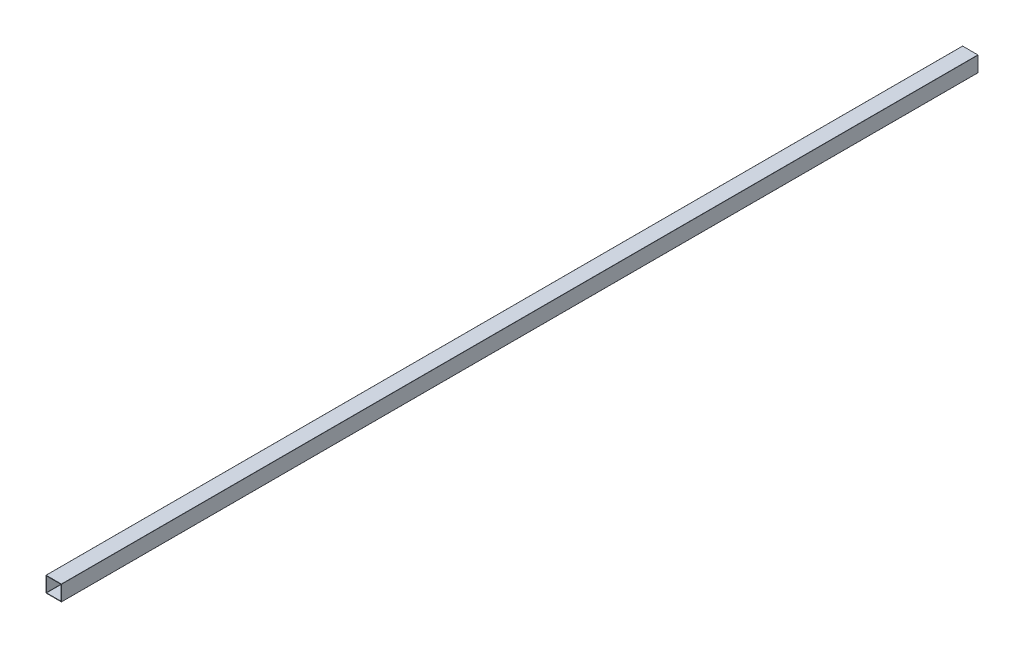
ISO-10303-21;
HEADER;
FILE_DESCRIPTION(('STEP AP214'),'2;1');
FILE_NAME('part.step','',(''),(''),'','','');
FILE_SCHEMA(('AUTOMOTIVE_DESIGN { 1 0 10303 214 1 1 1 1 }'));
ENDSEC;
DATA;
#1=APPLICATION_CONTEXT('core data for automotive mechanical design processes');
#2=APPLICATION_PROTOCOL_DEFINITION('international standard','automotive_design',2000,#1);
#3=PRODUCT_CONTEXT('',#1,'mechanical');
#4=PRODUCT('Part','Part','',(#3));
#5=PRODUCT_RELATED_PRODUCT_CATEGORY('part','',(#4));
#6=PRODUCT_DEFINITION_FORMATION('','',#4);
#7=PRODUCT_DEFINITION_CONTEXT('part definition',#1,'design');
#8=PRODUCT_DEFINITION('design','',#6,#7);
#9=PRODUCT_DEFINITION_SHAPE('','',#8);
#10=(LENGTH_UNIT() NAMED_UNIT(*) SI_UNIT(.MILLI.,.METRE.));
#11=(NAMED_UNIT(*) PLANE_ANGLE_UNIT() SI_UNIT($,.RADIAN.));
#12=(NAMED_UNIT(*) SI_UNIT($,.STERADIAN.) SOLID_ANGLE_UNIT());
#13=UNCERTAINTY_MEASURE_WITH_UNIT(LENGTH_MEASURE(1.E-05),#10,'distance_accuracy_value','');
#14=(GEOMETRIC_REPRESENTATION_CONTEXT(3) GLOBAL_UNCERTAINTY_ASSIGNED_CONTEXT((#13)) GLOBAL_UNIT_ASSIGNED_CONTEXT((#10,
#11,#12)) REPRESENTATION_CONTEXT('',''));
#15=CARTESIAN_POINT('',(0.,0.,0.));
#16=DIRECTION('',(0.,0.,1.));
#17=DIRECTION('',(1.,0.,0.));
#18=AXIS2_PLACEMENT_3D('',#15,#16,#17);
#19=CARTESIAN_POINT('',(50.8,-50.8,-6000.));
#20=DIRECTION('',(1.,0.,0.));
#21=DIRECTION('',(0.,0.,-1.));
#22=AXIS2_PLACEMENT_3D('',#19,#20,#21);
#23=PLANE('',#22);
#24=DIRECTION('',(0.,1.,0.));
#25=VECTOR('',#24,1.);
#26=CARTESIAN_POINT('',(50.8,-50.8,0.));
#27=LINE('',#26,#25);
#28=CARTESIAN_POINT('',(50.8,-49.8,0.));
#29=VERTEX_POINT('',#28);
#30=CARTESIAN_POINT('',(50.8,49.8,0.));
#31=VERTEX_POINT('',#30);
#32=EDGE_CURVE('E197',#29,#31,#27,.T.);
#33=ORIENTED_EDGE('',*,*,#32,.F.);
#34=DIRECTION('',(0.,0.,1.));
#35=VECTOR('',#34,1.);
#36=CARTESIAN_POINT('',(50.8,-49.8,-6000.));
#37=LINE('',#36,#35);
#38=CARTESIAN_POINT('',(50.8,-49.8,-6000.));
#39=VERTEX_POINT('',#38);
#40=EDGE_CURVE('E158',#29,#39,#37,.F.);
#41=ORIENTED_EDGE('',*,*,#40,.T.);
#42=DIRECTION('',(0.,1.,0.));
#43=VECTOR('',#42,1.);
#44=CARTESIAN_POINT('',(50.8,-50.8,-6000.));
#45=LINE('',#44,#43);
#46=CARTESIAN_POINT('',(50.8,49.8,-6000.));
#47=VERTEX_POINT('',#46);
#48=EDGE_CURVE('E185',#39,#47,#45,.T.);
#49=ORIENTED_EDGE('',*,*,#48,.T.);
#50=DIRECTION('',(0.,0.,1.));
#51=VECTOR('',#50,1.);
#52=CARTESIAN_POINT('',(50.8,49.8,-6000.));
#53=LINE('',#52,#51);
#54=EDGE_CURVE('E251',#47,#31,#53,.T.);
#55=ORIENTED_EDGE('',*,*,#54,.T.);
#56=EDGE_LOOP('',(#33,#41,#49,#55));
#57=FACE_BOUND('',#56,.T.);
#58=ADVANCED_FACE('F33',(#57),#23,.T.);
#59=CARTESIAN_POINT('',(-50.8,-50.8,-6000.));
#60=DIRECTION('',(0.,-1.,0.));
#61=DIRECTION('',(0.,0.,-1.));
#62=AXIS2_PLACEMENT_3D('',#59,#60,#61);
#63=PLANE('',#62);
#64=DIRECTION('',(1.,0.,0.));
#65=VECTOR('',#64,1.);
#66=CARTESIAN_POINT('',(-50.8,-50.8,0.));
#67=LINE('',#66,#65);
#68=CARTESIAN_POINT('',(-49.8,-50.8,0.));
#69=VERTEX_POINT('',#68);
#70=CARTESIAN_POINT('',(49.8,-50.8,0.));
#71=VERTEX_POINT('',#70);
#72=EDGE_CURVE('E189',#69,#71,#67,.T.);
#73=ORIENTED_EDGE('',*,*,#72,.F.);
#74=DIRECTION('',(0.,0.,1.));
#75=VECTOR('',#74,1.);
#76=CARTESIAN_POINT('',(-49.8,-50.8,-6000.));
#77=LINE('',#76,#75);
#78=CARTESIAN_POINT('',(-49.8,-50.8,-6000.));
#79=VERTEX_POINT('',#78);
#80=EDGE_CURVE('E238',#69,#79,#77,.F.);
#81=ORIENTED_EDGE('',*,*,#80,.T.);
#82=DIRECTION('',(1.,0.,0.));
#83=VECTOR('',#82,1.);
#84=CARTESIAN_POINT('',(-50.8,-50.8,-6000.));
#85=LINE('',#84,#83);
#86=CARTESIAN_POINT('',(49.8,-50.8,-6000.));
#87=VERTEX_POINT('',#86);
#88=EDGE_CURVE('E194',#79,#87,#85,.T.);
#89=ORIENTED_EDGE('',*,*,#88,.T.);
#90=DIRECTION('',(0.,0.,1.));
#91=VECTOR('',#90,1.);
#92=CARTESIAN_POINT('',(49.8,-50.8,-6000.));
#93=LINE('',#92,#91);
#94=EDGE_CURVE('E235',#87,#71,#93,.T.);
#95=ORIENTED_EDGE('',*,*,#94,.T.);
#96=EDGE_LOOP('',(#73,#81,#89,#95));
#97=FACE_BOUND('',#96,.T.);
#98=ADVANCED_FACE('F305',(#97),#63,.T.);
#99=CARTESIAN_POINT('',(-50.8,-50.8,-6000.));
#100=DIRECTION('',(-1.,0.,0.));
#101=DIRECTION('',(0.,0.,1.));
#102=AXIS2_PLACEMENT_3D('',#99,#100,#101);
#103=PLANE('',#102);
#104=DIRECTION('',(0.,-1.,0.));
#105=VECTOR('',#104,1.);
#106=CARTESIAN_POINT('',(-50.8,-50.8,-6000.));
#107=LINE('',#106,#105);
#108=CARTESIAN_POINT('',(-50.8,49.8,-6000.));
#109=VERTEX_POINT('',#108);
#110=CARTESIAN_POINT('',(-50.8,-49.8,-6000.));
#111=VERTEX_POINT('',#110);
#112=EDGE_CURVE('E191',#109,#111,#107,.T.);
#113=ORIENTED_EDGE('',*,*,#112,.T.);
#114=DIRECTION('',(0.,0.,1.));
#115=VECTOR('',#114,1.);
#116=CARTESIAN_POINT('',(-50.8,-49.8,-6000.));
#117=LINE('',#116,#115);
#118=CARTESIAN_POINT('',(-50.8,-49.8,0.));
#119=VERTEX_POINT('',#118);
#120=EDGE_CURVE('E224',#111,#119,#117,.T.);
#121=ORIENTED_EDGE('',*,*,#120,.T.);
#122=DIRECTION('',(0.,-1.,0.));
#123=VECTOR('',#122,1.);
#124=CARTESIAN_POINT('',(-50.8,-50.8,0.));
#125=LINE('',#124,#123);
#126=CARTESIAN_POINT('',(-50.8,49.8,0.));
#127=VERTEX_POINT('',#126);
#128=EDGE_CURVE('E203',#127,#119,#125,.T.);
#129=ORIENTED_EDGE('',*,*,#128,.F.);
#130=DIRECTION('',(0.,0.,1.));
#131=VECTOR('',#130,1.);
#132=CARTESIAN_POINT('',(-50.8,49.8,-6000.));
#133=LINE('',#132,#131);
#134=EDGE_CURVE('E222',#127,#109,#133,.F.);
#135=ORIENTED_EDGE('',*,*,#134,.T.);
#136=EDGE_LOOP('',(#113,#121,#129,#135));
#137=FACE_BOUND('',#136,.T.);
#138=ADVANCED_FACE('F311',(#137),#103,.T.);
#139=CARTESIAN_POINT('',(-50.8,50.8,-6000.));
#140=DIRECTION('',(0.,1.,0.));
#141=DIRECTION('',(0.,0.,1.));
#142=AXIS2_PLACEMENT_3D('',#139,#140,#141);
#143=PLANE('',#142);
#144=DIRECTION('',(-1.,0.,0.));
#145=VECTOR('',#144,1.);
#146=CARTESIAN_POINT('',(-50.8,50.8,-6000.));
#147=LINE('',#146,#145);
#148=CARTESIAN_POINT('',(49.8,50.8,-6000.));
#149=VERTEX_POINT('',#148);
#150=CARTESIAN_POINT('',(-49.8,50.8,-6000.));
#151=VERTEX_POINT('',#150);
#152=EDGE_CURVE('E188',#149,#151,#147,.T.);
#153=ORIENTED_EDGE('',*,*,#152,.T.);
#154=DIRECTION('',(0.,0.,1.));
#155=VECTOR('',#154,1.);
#156=CARTESIAN_POINT('',(-49.8,50.8,-6000.));
#157=LINE('',#156,#155);
#158=CARTESIAN_POINT('',(-49.8,50.8,0.));
#159=VERTEX_POINT('',#158);
#160=EDGE_CURVE('E248',#151,#159,#157,.T.);
#161=ORIENTED_EDGE('',*,*,#160,.T.);
#162=DIRECTION('',(-1.,0.,0.));
#163=VECTOR('',#162,1.);
#164=CARTESIAN_POINT('',(-50.8,50.8,0.));
#165=LINE('',#164,#163);
#166=CARTESIAN_POINT('',(49.8,50.8,0.));
#167=VERTEX_POINT('',#166);
#168=EDGE_CURVE('E200',#167,#159,#165,.T.);
#169=ORIENTED_EDGE('',*,*,#168,.F.);
#170=DIRECTION('',(0.,0.,1.));
#171=VECTOR('',#170,1.);
#172=CARTESIAN_POINT('',(49.8,50.8,-6000.));
#173=LINE('',#172,#171);
#174=EDGE_CURVE('E55',#167,#149,#173,.F.);
#175=ORIENTED_EDGE('',*,*,#174,.T.);
#176=EDGE_LOOP('',(#153,#161,#169,#175));
#177=FACE_BOUND('',#176,.T.);
#178=ADVANCED_FACE('F316',(#177),#143,.T.);
#179=CARTESIAN_POINT('',(0.,0.,-6000.));
#180=DIRECTION('',(0.,0.,-1.));
#181=DIRECTION('',(-1.,0.,0.));
#182=AXIS2_PLACEMENT_3D('',#179,#180,#181);
#183=PLANE('',#182);
#184=DIRECTION('',(0.,-1.,0.));
#185=VECTOR('',#184,1.);
#186=CARTESIAN_POINT('',(-47.76,-47.76,-6000.));
#187=LINE('',#186,#185);
#188=CARTESIAN_POINT('',(-47.76,46.76,-6000.));
#189=VERTEX_POINT('',#188);
#190=CARTESIAN_POINT('',(-47.76,-46.76,-6000.));
#191=VERTEX_POINT('',#190);
#192=EDGE_CURVE('E167',#189,#191,#187,.T.);
#193=ORIENTED_EDGE('',*,*,#192,.T.);
#194=CARTESIAN_POINT('',(-46.76,-46.76,-6000.));
#195=DIRECTION('',(0.,0.,-1.));
#196=DIRECTION('',(-1.,0.,0.));
#197=AXIS2_PLACEMENT_3D('',#194,#195,#196);
#198=CIRCLE('',#197,1.);
#199=CARTESIAN_POINT('',(-46.76,-47.76,-6000.));
#200=VERTEX_POINT('',#199);
#201=EDGE_CURVE('E11',#191,#200,#198,.F.);
#202=ORIENTED_EDGE('',*,*,#201,.T.);
#203=DIRECTION('',(1.,0.,0.));
#204=VECTOR('',#203,1.);
#205=CARTESIAN_POINT('',(-47.76,-47.76,-6000.));
#206=LINE('',#205,#204);
#207=CARTESIAN_POINT('',(46.76,-47.76,-6000.));
#208=VERTEX_POINT('',#207);
#209=EDGE_CURVE('E175',#200,#208,#206,.T.);
#210=ORIENTED_EDGE('',*,*,#209,.T.);
#211=CARTESIAN_POINT('',(46.76,-46.76,-6000.));
#212=DIRECTION('',(0.,0.,-1.));
#213=DIRECTION('',(-1.,0.,0.));
#214=AXIS2_PLACEMENT_3D('',#211,#212,#213);
#215=CIRCLE('',#214,1.);
#216=CARTESIAN_POINT('',(47.76,-46.76,-6000.));
#217=VERTEX_POINT('',#216);
#218=EDGE_CURVE('E262',#208,#217,#215,.F.);
#219=ORIENTED_EDGE('',*,*,#218,.T.);
#220=DIRECTION('',(0.,1.,0.));
#221=VECTOR('',#220,1.);
#222=CARTESIAN_POINT('',(47.76,-47.76,-6000.));
#223=LINE('',#222,#221);
#224=CARTESIAN_POINT('',(47.76,46.76,-6000.));
#225=VERTEX_POINT('',#224);
#226=EDGE_CURVE('E179',#217,#225,#223,.T.);
#227=ORIENTED_EDGE('',*,*,#226,.T.);
#228=CARTESIAN_POINT('',(46.76,46.76,-6000.));
#229=DIRECTION('',(0.,0.,-1.));
#230=DIRECTION('',(-1.,0.,0.));
#231=AXIS2_PLACEMENT_3D('',#228,#229,#230);
#232=CIRCLE('',#231,1.);
#233=CARTESIAN_POINT('',(46.76,47.76,-6000.));
#234=VERTEX_POINT('',#233);
#235=EDGE_CURVE('E258',#225,#234,#232,.F.);
#236=ORIENTED_EDGE('',*,*,#235,.T.);
#237=DIRECTION('',(-1.,0.,0.));
#238=VECTOR('',#237,1.);
#239=CARTESIAN_POINT('',(-47.76,47.76,-6000.));
#240=LINE('',#239,#238);
#241=CARTESIAN_POINT('',(-46.76,47.76,-6000.));
#242=VERTEX_POINT('',#241);
#243=EDGE_CURVE('E277',#234,#242,#240,.T.);
#244=ORIENTED_EDGE('',*,*,#243,.T.);
#245=CARTESIAN_POINT('',(-46.76,46.76,-6000.));
#246=DIRECTION('',(0.,0.,-1.));
#247=DIRECTION('',(-1.,0.,0.));
#248=AXIS2_PLACEMENT_3D('',#245,#246,#247);
#249=CIRCLE('',#248,1.);
#250=EDGE_CURVE('E157',#242,#189,#249,.F.);
#251=ORIENTED_EDGE('',*,*,#250,.T.);
#252=EDGE_LOOP('',(#193,#202,#210,#219,#227,#236,#244,#251));
#253=FACE_BOUND('',#252,.T.);
#254=ORIENTED_EDGE('',*,*,#88,.F.);
#255=CARTESIAN_POINT('',(-49.8,-49.8,-6000.));
#256=DIRECTION('',(0.,0.,-1.));
#257=DIRECTION('',(-1.,0.,0.));
#258=AXIS2_PLACEMENT_3D('',#255,#256,#257);
#259=CIRCLE('',#258,1.);
#260=EDGE_CURVE('E245',#79,#111,#259,.T.);
#261=ORIENTED_EDGE('',*,*,#260,.T.);
#262=ORIENTED_EDGE('',*,*,#112,.F.);
#263=CARTESIAN_POINT('',(-49.8,49.8,-6000.));
#264=DIRECTION('',(0.,0.,-1.));
#265=DIRECTION('',(-1.,0.,0.));
#266=AXIS2_PLACEMENT_3D('',#263,#264,#265);
#267=CIRCLE('',#266,1.);
#268=EDGE_CURVE('E48',#109,#151,#267,.T.);
#269=ORIENTED_EDGE('',*,*,#268,.T.);
#270=ORIENTED_EDGE('',*,*,#152,.F.);
#271=CARTESIAN_POINT('',(49.8,49.8,-6000.));
#272=DIRECTION('',(0.,0.,-1.));
#273=DIRECTION('',(-1.,0.,0.));
#274=AXIS2_PLACEMENT_3D('',#271,#272,#273);
#275=CIRCLE('',#274,1.);
#276=EDGE_CURVE('E240',#149,#47,#275,.T.);
#277=ORIENTED_EDGE('',*,*,#276,.T.);
#278=ORIENTED_EDGE('',*,*,#48,.F.);
#279=CARTESIAN_POINT('',(49.8,-49.8,-6000.));
#280=DIRECTION('',(0.,0.,-1.));
#281=DIRECTION('',(-1.,0.,0.));
#282=AXIS2_PLACEMENT_3D('',#279,#280,#281);
#283=CIRCLE('',#282,1.);
#284=EDGE_CURVE('E242',#39,#87,#283,.T.);
#285=ORIENTED_EDGE('',*,*,#284,.T.);
#286=EDGE_LOOP('',(#254,#261,#262,#269,#270,#277,#278,#285));
#287=FACE_BOUND('',#286,.T.);
#288=ADVANCED_FACE('F267',(#253,#287),#183,.T.);
#289=CARTESIAN_POINT('',(0.,0.,0.));
#290=DIRECTION('',(0.,0.,-1.));
#291=DIRECTION('',(-1.,0.,0.));
#292=AXIS2_PLACEMENT_3D('',#289,#290,#291);
#293=PLANE('',#292);
#294=DIRECTION('',(0.,1.,0.));
#295=VECTOR('',#294,1.);
#296=CARTESIAN_POINT('',(47.76,-47.76,0.));
#297=LINE('',#296,#295);
#298=CARTESIAN_POINT('',(47.76,-46.76,0.));
#299=VERTEX_POINT('',#298);
#300=CARTESIAN_POINT('',(47.76,46.76,0.));
#301=VERTEX_POINT('',#300);
#302=EDGE_CURVE('E181',#299,#301,#297,.T.);
#303=ORIENTED_EDGE('',*,*,#302,.F.);
#304=CARTESIAN_POINT('',(46.76,-46.76,0.));
#305=DIRECTION('',(0.,0.,-1.));
#306=DIRECTION('',(-1.,0.,0.));
#307=AXIS2_PLACEMENT_3D('',#304,#305,#306);
#308=CIRCLE('',#307,1.);
#309=CARTESIAN_POINT('',(46.76,-47.76,0.));
#310=VERTEX_POINT('',#309);
#311=EDGE_CURVE('E260',#299,#310,#308,.T.);
#312=ORIENTED_EDGE('',*,*,#311,.T.);
#313=DIRECTION('',(1.,0.,0.));
#314=VECTOR('',#313,1.);
#315=CARTESIAN_POINT('',(-47.76,-47.76,0.));
#316=LINE('',#315,#314);
#317=CARTESIAN_POINT('',(-46.76,-47.76,0.));
#318=VERTEX_POINT('',#317);
#319=EDGE_CURVE('E281',#318,#310,#316,.T.);
#320=ORIENTED_EDGE('',*,*,#319,.F.);
#321=CARTESIAN_POINT('',(-46.76,-46.76,0.));
#322=DIRECTION('',(0.,0.,-1.));
#323=DIRECTION('',(-1.,0.,0.));
#324=AXIS2_PLACEMENT_3D('',#321,#322,#323);
#325=CIRCLE('',#324,1.);
#326=CARTESIAN_POINT('',(-47.76,-46.76,0.));
#327=VERTEX_POINT('',#326);
#328=EDGE_CURVE('E41',#318,#327,#325,.T.);
#329=ORIENTED_EDGE('',*,*,#328,.T.);
#330=DIRECTION('',(0.,-1.,0.));
#331=VECTOR('',#330,1.);
#332=CARTESIAN_POINT('',(-47.76,-47.76,0.));
#333=LINE('',#332,#331);
#334=CARTESIAN_POINT('',(-47.76,46.76,0.));
#335=VERTEX_POINT('',#334);
#336=EDGE_CURVE('E164',#335,#327,#333,.T.);
#337=ORIENTED_EDGE('',*,*,#336,.F.);
#338=CARTESIAN_POINT('',(-46.76,46.76,0.));
#339=DIRECTION('',(0.,0.,-1.));
#340=DIRECTION('',(-1.,0.,0.));
#341=AXIS2_PLACEMENT_3D('',#338,#339,#340);
#342=CIRCLE('',#341,1.);
#343=CARTESIAN_POINT('',(-46.76,47.76,0.));
#344=VERTEX_POINT('',#343);
#345=EDGE_CURVE('E147',#335,#344,#342,.T.);
#346=ORIENTED_EDGE('',*,*,#345,.T.);
#347=DIRECTION('',(-1.,0.,0.));
#348=VECTOR('',#347,1.);
#349=CARTESIAN_POINT('',(-47.76,47.76,0.));
#350=LINE('',#349,#348);
#351=CARTESIAN_POINT('',(46.76,47.76,0.));
#352=VERTEX_POINT('',#351);
#353=EDGE_CURVE('E176',#352,#344,#350,.T.);
#354=ORIENTED_EDGE('',*,*,#353,.F.);
#355=CARTESIAN_POINT('',(46.76,46.76,0.));
#356=DIRECTION('',(0.,0.,-1.));
#357=DIRECTION('',(-1.,0.,0.));
#358=AXIS2_PLACEMENT_3D('',#355,#356,#357);
#359=CIRCLE('',#358,1.);
#360=EDGE_CURVE('E256',#352,#301,#359,.T.);
#361=ORIENTED_EDGE('',*,*,#360,.T.);
#362=EDGE_LOOP('',(#303,#312,#320,#329,#337,#346,#354,#361));
#363=FACE_BOUND('',#362,.T.);
#364=ORIENTED_EDGE('',*,*,#128,.T.);
#365=CARTESIAN_POINT('',(-49.8,-49.8,0.));
#366=DIRECTION('',(0.,0.,-1.));
#367=DIRECTION('',(-1.,0.,0.));
#368=AXIS2_PLACEMENT_3D('',#365,#366,#367);
#369=CIRCLE('',#368,1.);
#370=EDGE_CURVE('E233',#119,#69,#369,.F.);
#371=ORIENTED_EDGE('',*,*,#370,.T.);
#372=ORIENTED_EDGE('',*,*,#72,.T.);
#373=CARTESIAN_POINT('',(49.8,-49.8,0.));
#374=DIRECTION('',(0.,0.,-1.));
#375=DIRECTION('',(-1.,0.,0.));
#376=AXIS2_PLACEMENT_3D('',#373,#374,#375);
#377=CIRCLE('',#376,1.);
#378=EDGE_CURVE('E229',#71,#29,#377,.F.);
#379=ORIENTED_EDGE('',*,*,#378,.T.);
#380=ORIENTED_EDGE('',*,*,#32,.T.);
#381=CARTESIAN_POINT('',(49.8,49.8,0.));
#382=DIRECTION('',(0.,0.,-1.));
#383=DIRECTION('',(-1.,0.,0.));
#384=AXIS2_PLACEMENT_3D('',#381,#382,#383);
#385=CIRCLE('',#384,1.);
#386=EDGE_CURVE('E227',#31,#167,#385,.F.);
#387=ORIENTED_EDGE('',*,*,#386,.T.);
#388=ORIENTED_EDGE('',*,*,#168,.T.);
#389=CARTESIAN_POINT('',(-49.8,49.8,0.));
#390=DIRECTION('',(0.,0.,-1.));
#391=DIRECTION('',(-1.,0.,0.));
#392=AXIS2_PLACEMENT_3D('',#389,#390,#391);
#393=CIRCLE('',#392,1.);
#394=EDGE_CURVE('E231',#159,#127,#393,.F.);
#395=ORIENTED_EDGE('',*,*,#394,.T.);
#396=EDGE_LOOP('',(#364,#371,#372,#379,#380,#387,#388,#395));
#397=FACE_BOUND('',#396,.T.);
#398=ADVANCED_FACE('F172',(#363,#397),#293,.F.);
#399=CARTESIAN_POINT('',(-47.76,-47.76,-6000.));
#400=DIRECTION('',(0.,-1.,0.));
#401=DIRECTION('',(0.,0.,-1.));
#402=AXIS2_PLACEMENT_3D('',#399,#400,#401);
#403=PLANE('',#402);
#404=ORIENTED_EDGE('',*,*,#319,.T.);
#405=DIRECTION('',(0.,0.,1.));
#406=VECTOR('',#405,1.);
#407=CARTESIAN_POINT('',(46.76,-47.76,-6000.));
#408=LINE('',#407,#406);
#409=EDGE_CURVE('E220',#310,#208,#408,.F.);
#410=ORIENTED_EDGE('',*,*,#409,.T.);
#411=ORIENTED_EDGE('',*,*,#209,.F.);
#412=DIRECTION('',(0.,0.,1.));
#413=VECTOR('',#412,1.);
#414=CARTESIAN_POINT('',(-46.76,-47.76,0.));
#415=LINE('',#414,#413);
#416=EDGE_CURVE('E217',#200,#318,#415,.T.);
#417=ORIENTED_EDGE('',*,*,#416,.T.);
#418=EDGE_LOOP('',(#404,#410,#411,#417));
#419=FACE_BOUND('',#418,.T.);
#420=ADVANCED_FACE('F283',(#419),#403,.F.);
#421=CARTESIAN_POINT('',(-47.76,-47.76,-6000.));
#422=DIRECTION('',(-1.,0.,0.));
#423=DIRECTION('',(0.,0.,1.));
#424=AXIS2_PLACEMENT_3D('',#421,#422,#423);
#425=PLANE('',#424);
#426=ORIENTED_EDGE('',*,*,#192,.F.);
#427=DIRECTION('',(0.,0.,1.));
#428=VECTOR('',#427,1.);
#429=CARTESIAN_POINT('',(-47.76,46.76,0.));
#430=LINE('',#429,#428);
#431=EDGE_CURVE('E151',#189,#335,#430,.T.);
#432=ORIENTED_EDGE('',*,*,#431,.T.);
#433=ORIENTED_EDGE('',*,*,#336,.T.);
#434=DIRECTION('',(0.,0.,1.));
#435=VECTOR('',#434,1.);
#436=CARTESIAN_POINT('',(-47.76,-46.76,-6000.));
#437=LINE('',#436,#435);
#438=EDGE_CURVE('E169',#327,#191,#437,.F.);
#439=ORIENTED_EDGE('',*,*,#438,.T.);
#440=EDGE_LOOP('',(#426,#432,#433,#439));
#441=FACE_BOUND('',#440,.T.);
#442=ADVANCED_FACE('F163',(#441),#425,.F.);
#443=CARTESIAN_POINT('',(-47.76,47.76,-6000.));
#444=DIRECTION('',(0.,1.,0.));
#445=DIRECTION('',(-1.,0.,0.));
#446=AXIS2_PLACEMENT_3D('',#443,#444,#445);
#447=PLANE('',#446);
#448=ORIENTED_EDGE('',*,*,#353,.T.);
#449=DIRECTION('',(0.,0.,1.));
#450=VECTOR('',#449,1.);
#451=CARTESIAN_POINT('',(-46.76,47.76,-6000.));
#452=LINE('',#451,#450);
#453=EDGE_CURVE('E152',#344,#242,#452,.F.);
#454=ORIENTED_EDGE('',*,*,#453,.T.);
#455=ORIENTED_EDGE('',*,*,#243,.F.);
#456=DIRECTION('',(0.,0.,1.));
#457=VECTOR('',#456,1.);
#458=CARTESIAN_POINT('',(46.76,47.76,0.));
#459=LINE('',#458,#457);
#460=EDGE_CURVE('E168',#234,#352,#459,.T.);
#461=ORIENTED_EDGE('',*,*,#460,.T.);
#462=EDGE_LOOP('',(#448,#454,#455,#461));
#463=FACE_BOUND('',#462,.T.);
#464=ADVANCED_FACE('F292',(#463),#447,.F.);
#465=CARTESIAN_POINT('',(47.76,-47.76,-6000.));
#466=DIRECTION('',(1.,0.,0.));
#467=DIRECTION('',(0.,0.,-1.));
#468=AXIS2_PLACEMENT_3D('',#465,#466,#467);
#469=PLANE('',#468);
#470=ORIENTED_EDGE('',*,*,#302,.T.);
#471=DIRECTION('',(0.,0.,1.));
#472=VECTOR('',#471,1.);
#473=CARTESIAN_POINT('',(47.76,46.76,-6000.));
#474=LINE('',#473,#472);
#475=EDGE_CURVE('E215',#301,#225,#474,.F.);
#476=ORIENTED_EDGE('',*,*,#475,.T.);
#477=ORIENTED_EDGE('',*,*,#226,.F.);
#478=DIRECTION('',(0.,0.,1.));
#479=VECTOR('',#478,1.);
#480=CARTESIAN_POINT('',(47.76,-46.76,0.));
#481=LINE('',#480,#479);
#482=EDGE_CURVE('E212',#217,#299,#481,.T.);
#483=ORIENTED_EDGE('',*,*,#482,.T.);
#484=EDGE_LOOP('',(#470,#476,#477,#483));
#485=FACE_BOUND('',#484,.T.);
#486=ADVANCED_FACE('F275',(#485),#469,.F.);
#487=CARTESIAN_POINT('',(-46.76,46.76,-6000.));
#488=DIRECTION('',(0.,0.,-1.));
#489=DIRECTION('',(-1.,0.,0.));
#490=AXIS2_PLACEMENT_3D('',#487,#488,#489);
#491=CYLINDRICAL_SURFACE('',#490,1.);
#492=ORIENTED_EDGE('',*,*,#250,.F.);
#493=ORIENTED_EDGE('',*,*,#453,.F.);
#494=ORIENTED_EDGE('',*,*,#345,.F.);
#495=ORIENTED_EDGE('',*,*,#431,.F.);
#496=EDGE_LOOP('',(#492,#493,#494,#495));
#497=FACE_BOUND('',#496,.T.);
#498=ADVANCED_FACE('F150',(#497),#491,.F.);
#499=CARTESIAN_POINT('',(46.76,46.76,-6000.));
#500=DIRECTION('',(0.,0.,-1.));
#501=DIRECTION('',(-1.,0.,0.));
#502=AXIS2_PLACEMENT_3D('',#499,#500,#501);
#503=CYLINDRICAL_SURFACE('',#502,1.);
#504=ORIENTED_EDGE('',*,*,#235,.F.);
#505=ORIENTED_EDGE('',*,*,#475,.F.);
#506=ORIENTED_EDGE('',*,*,#360,.F.);
#507=ORIENTED_EDGE('',*,*,#460,.F.);
#508=EDGE_LOOP('',(#504,#505,#506,#507));
#509=FACE_BOUND('',#508,.T.);
#510=ADVANCED_FACE('F294',(#509),#503,.F.);
#511=CARTESIAN_POINT('',(46.76,-46.76,-6000.));
#512=DIRECTION('',(0.,0.,-1.));
#513=DIRECTION('',(-1.,0.,0.));
#514=AXIS2_PLACEMENT_3D('',#511,#512,#513);
#515=CYLINDRICAL_SURFACE('',#514,1.);
#516=ORIENTED_EDGE('',*,*,#218,.F.);
#517=ORIENTED_EDGE('',*,*,#409,.F.);
#518=ORIENTED_EDGE('',*,*,#311,.F.);
#519=ORIENTED_EDGE('',*,*,#482,.F.);
#520=EDGE_LOOP('',(#516,#517,#518,#519));
#521=FACE_BOUND('',#520,.T.);
#522=ADVANCED_FACE('F279',(#521),#515,.F.);
#523=CARTESIAN_POINT('',(-49.8,-49.8,-6000.));
#524=DIRECTION('',(0.,0.,1.));
#525=DIRECTION('',(1.,0.,0.));
#526=AXIS2_PLACEMENT_3D('',#523,#524,#525);
#527=CYLINDRICAL_SURFACE('',#526,1.);
#528=ORIENTED_EDGE('',*,*,#260,.F.);
#529=ORIENTED_EDGE('',*,*,#80,.F.);
#530=ORIENTED_EDGE('',*,*,#370,.F.);
#531=ORIENTED_EDGE('',*,*,#120,.F.);
#532=EDGE_LOOP('',(#528,#529,#530,#531));
#533=FACE_BOUND('',#532,.T.);
#534=ADVANCED_FACE('F301',(#533),#527,.T.);
#535=CARTESIAN_POINT('',(-49.8,49.8,-6000.));
#536=DIRECTION('',(0.,0.,1.));
#537=DIRECTION('',(1.,0.,0.));
#538=AXIS2_PLACEMENT_3D('',#535,#536,#537);
#539=CYLINDRICAL_SURFACE('',#538,1.);
#540=ORIENTED_EDGE('',*,*,#268,.F.);
#541=ORIENTED_EDGE('',*,*,#134,.F.);
#542=ORIENTED_EDGE('',*,*,#394,.F.);
#543=ORIENTED_EDGE('',*,*,#160,.F.);
#544=EDGE_LOOP('',(#540,#541,#542,#543));
#545=FACE_BOUND('',#544,.T.);
#546=ADVANCED_FACE('F368',(#545),#539,.T.);
#547=CARTESIAN_POINT('',(-46.76,-46.76,-6000.));
#548=DIRECTION('',(0.,0.,-1.));
#549=DIRECTION('',(-1.,0.,0.));
#550=AXIS2_PLACEMENT_3D('',#547,#548,#549);
#551=CYLINDRICAL_SURFACE('',#550,1.);
#552=ORIENTED_EDGE('',*,*,#201,.F.);
#553=ORIENTED_EDGE('',*,*,#438,.F.);
#554=ORIENTED_EDGE('',*,*,#328,.F.);
#555=ORIENTED_EDGE('',*,*,#416,.F.);
#556=EDGE_LOOP('',(#552,#553,#554,#555));
#557=FACE_BOUND('',#556,.T.);
#558=ADVANCED_FACE('F378',(#557),#551,.F.);
#559=CARTESIAN_POINT('',(49.8,-49.8,-6000.));
#560=DIRECTION('',(0.,0.,1.));
#561=DIRECTION('',(1.,0.,0.));
#562=AXIS2_PLACEMENT_3D('',#559,#560,#561);
#563=CYLINDRICAL_SURFACE('',#562,1.);
#564=ORIENTED_EDGE('',*,*,#284,.F.);
#565=ORIENTED_EDGE('',*,*,#40,.F.);
#566=ORIENTED_EDGE('',*,*,#378,.F.);
#567=ORIENTED_EDGE('',*,*,#94,.F.);
#568=EDGE_LOOP('',(#564,#565,#566,#567));
#569=FACE_BOUND('',#568,.T.);
#570=ADVANCED_FACE('F388',(#569),#563,.T.);
#571=CARTESIAN_POINT('',(49.8,49.8,-6000.));
#572=DIRECTION('',(0.,0.,1.));
#573=DIRECTION('',(1.,0.,0.));
#574=AXIS2_PLACEMENT_3D('',#571,#572,#573);
#575=CYLINDRICAL_SURFACE('',#574,1.);
#576=ORIENTED_EDGE('',*,*,#276,.F.);
#577=ORIENTED_EDGE('',*,*,#174,.F.);
#578=ORIENTED_EDGE('',*,*,#386,.F.);
#579=ORIENTED_EDGE('',*,*,#54,.F.);
#580=EDGE_LOOP('',(#576,#577,#578,#579));
#581=FACE_BOUND('',#580,.T.);
#582=ADVANCED_FACE('F35',(#581),#575,.T.);
#583=CLOSED_SHELL('',(#58,#98,#138,#178,#288,#398,#420,#442,#464,#486,#498,#510,#522,#534,#546,
#558,#570,#582));
#584=MANIFOLD_SOLID_BREP('B2',#583);
#585=ADVANCED_BREP_SHAPE_REPRESENTATION('',(#18,#584),#14);
#586=SHAPE_DEFINITION_REPRESENTATION(#9,#585);
ENDSEC;
END-ISO-10303-21;
